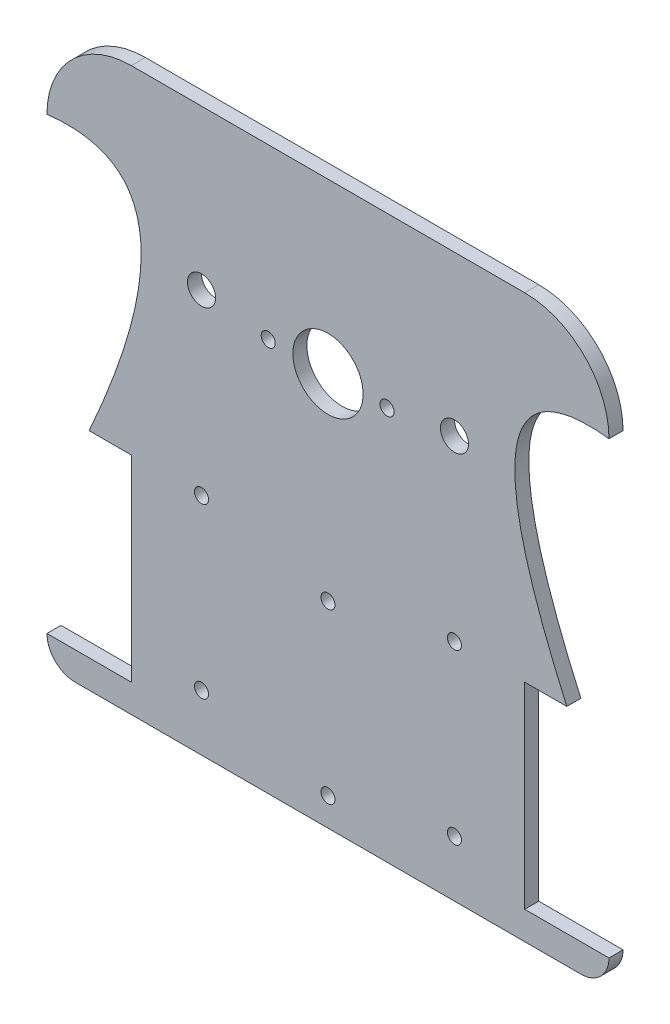
ISO-10303-21;
HEADER;
FILE_DESCRIPTION(('STEP AP214'),'2;1');
FILE_NAME('part.step','',(''),(''),'','','');
FILE_SCHEMA(('AUTOMOTIVE_DESIGN { 1 0 10303 214 1 1 1 1 }'));
ENDSEC;
DATA;
#1=APPLICATION_CONTEXT('core data for automotive mechanical design processes');
#2=APPLICATION_PROTOCOL_DEFINITION('international standard','automotive_design',2000,#1);
#3=PRODUCT_CONTEXT('',#1,'mechanical');
#4=PRODUCT('Part','Part','',(#3));
#5=PRODUCT_RELATED_PRODUCT_CATEGORY('part','',(#4));
#6=PRODUCT_DEFINITION_FORMATION('','',#4);
#7=PRODUCT_DEFINITION_CONTEXT('part definition',#1,'design');
#8=PRODUCT_DEFINITION('design','',#6,#7);
#9=PRODUCT_DEFINITION_SHAPE('','',#8);
#10=(LENGTH_UNIT() NAMED_UNIT(*) SI_UNIT(.MILLI.,.METRE.));
#11=(NAMED_UNIT(*) PLANE_ANGLE_UNIT() SI_UNIT($,.RADIAN.));
#12=(NAMED_UNIT(*) SI_UNIT($,.STERADIAN.) SOLID_ANGLE_UNIT());
#13=UNCERTAINTY_MEASURE_WITH_UNIT(LENGTH_MEASURE(1.E-05),#10,'distance_accuracy_value','');
#14=(GEOMETRIC_REPRESENTATION_CONTEXT(3) GLOBAL_UNCERTAINTY_ASSIGNED_CONTEXT((#13)) GLOBAL_UNIT_ASSIGNED_CONTEXT((#10,
#11,#12)) REPRESENTATION_CONTEXT('',''));
#15=CARTESIAN_POINT('',(0.,0.,0.));
#16=DIRECTION('',(0.,0.,1.));
#17=DIRECTION('',(1.,0.,0.));
#18=AXIS2_PLACEMENT_3D('',#15,#16,#17);
#19=CARTESIAN_POINT('',(90.,-90.,5.));
#20=DIRECTION('',(0.,0.,-1.));
#21=DIRECTION('',(-1.,0.,0.));
#22=AXIS2_PLACEMENT_3D('',#19,#20,#21);
#23=CYLINDRICAL_SURFACE('',#22,9.99999999999999);
#24=CARTESIAN_POINT('',(90.,-90.,0.));
#25=DIRECTION('',(0.,0.,1.));
#26=DIRECTION('',(1.,0.,0.));
#27=AXIS2_PLACEMENT_3D('',#24,#25,#26);
#28=CIRCLE('',#27,9.99999999999999);
#29=CARTESIAN_POINT('',(89.9999999999999,-100.,0.));
#30=VERTEX_POINT('',#29);
#31=CARTESIAN_POINT('',(100.,-90.,0.));
#32=VERTEX_POINT('',#31);
#33=EDGE_CURVE('E172',#30,#32,#28,.T.);
#34=ORIENTED_EDGE('',*,*,#33,.T.);
#35=DIRECTION('',(0.,0.,-1.));
#36=VECTOR('',#35,1.);
#37=CARTESIAN_POINT('',(100.,-89.9999999999999,5.));
#38=LINE('',#37,#36);
#39=CARTESIAN_POINT('',(100.,-90.,5.));
#40=VERTEX_POINT('',#39);
#41=EDGE_CURVE('E11',#40,#32,#38,.T.);
#42=ORIENTED_EDGE('',*,*,#41,.F.);
#43=CARTESIAN_POINT('',(90.,-90.,5.));
#44=DIRECTION('',(0.,0.,1.));
#45=DIRECTION('',(1.,0.,0.));
#46=AXIS2_PLACEMENT_3D('',#43,#44,#45);
#47=CIRCLE('',#46,9.99999999999999);
#48=CARTESIAN_POINT('',(89.9999999999999,-100.,5.));
#49=VERTEX_POINT('',#48);
#50=EDGE_CURVE('E194',#49,#40,#47,.T.);
#51=ORIENTED_EDGE('',*,*,#50,.F.);
#52=DIRECTION('',(0.,0.,-1.));
#53=VECTOR('',#52,1.);
#54=CARTESIAN_POINT('',(89.9999999999999,-100.,5.));
#55=LINE('',#54,#53);
#56=EDGE_CURVE('E209',#49,#30,#55,.T.);
#57=ORIENTED_EDGE('',*,*,#56,.T.);
#58=EDGE_LOOP('',(#34,#42,#51,#57));
#59=FACE_BOUND('',#58,.T.);
#60=ADVANCED_FACE('F33',(#59),#23,.T.);
#61=CARTESIAN_POINT('',(70.,70.,5.));
#62=DIRECTION('',(0.,0.,-1.));
#63=DIRECTION('',(-1.,0.,0.));
#64=AXIS2_PLACEMENT_3D('',#61,#62,#63);
#65=CYLINDRICAL_SURFACE('',#64,30.);
#66=CARTESIAN_POINT('',(70.,70.,0.));
#67=DIRECTION('',(0.,0.,1.));
#68=DIRECTION('',(-1.,0.,0.));
#69=AXIS2_PLACEMENT_3D('',#66,#67,#68);
#70=CIRCLE('',#69,30.);
#71=CARTESIAN_POINT('',(100.,69.9999999999998,0.));
#72=VERTEX_POINT('',#71);
#73=CARTESIAN_POINT('',(69.9999999999998,100.,0.));
#74=VERTEX_POINT('',#73);
#75=EDGE_CURVE('E146',#72,#74,#70,.T.);
#76=ORIENTED_EDGE('',*,*,#75,.T.);
#77=DIRECTION('',(0.,0.,-1.));
#78=VECTOR('',#77,1.);
#79=CARTESIAN_POINT('',(69.9999999999998,100.,5.));
#80=LINE('',#79,#78);
#81=CARTESIAN_POINT('',(69.9999999999998,100.,5.));
#82=VERTEX_POINT('',#81);
#83=EDGE_CURVE('E234',#82,#74,#80,.T.);
#84=ORIENTED_EDGE('',*,*,#83,.F.);
#85=CARTESIAN_POINT('',(70.,70.,5.));
#86=DIRECTION('',(0.,0.,1.));
#87=DIRECTION('',(-1.,0.,0.));
#88=AXIS2_PLACEMENT_3D('',#85,#86,#87);
#89=CIRCLE('',#88,30.);
#90=CARTESIAN_POINT('',(100.,69.9999999999998,5.));
#91=VERTEX_POINT('',#90);
#92=EDGE_CURVE('E197',#91,#82,#89,.T.);
#93=ORIENTED_EDGE('',*,*,#92,.F.);
#94=DIRECTION('',(0.,0.,-1.));
#95=VECTOR('',#94,1.);
#96=CARTESIAN_POINT('',(100.,69.9999999999998,5.));
#97=LINE('',#96,#95);
#98=EDGE_CURVE('E40',#91,#72,#97,.T.);
#99=ORIENTED_EDGE('',*,*,#98,.T.);
#100=EDGE_LOOP('',(#76,#84,#93,#99));
#101=FACE_BOUND('',#100,.T.);
#102=ADVANCED_FACE('F238',(#101),#65,.T.);
#103=CARTESIAN_POINT('',(-69.9999999999998,100.,5.));
#104=DIRECTION('',(0.,-1.,0.));
#105=DIRECTION('',(0.,0.,-1.));
#106=AXIS2_PLACEMENT_3D('',#103,#104,#105);
#107=PLANE('',#106);
#108=DIRECTION('',(-1.,0.,0.));
#109=VECTOR('',#108,1.);
#110=CARTESIAN_POINT('',(-69.9999999999998,100.,0.));
#111=LINE('',#110,#109);
#112=CARTESIAN_POINT('',(-69.9999999999998,100.,0.));
#113=VERTEX_POINT('',#112);
#114=EDGE_CURVE('E213',#74,#113,#111,.T.);
#115=ORIENTED_EDGE('',*,*,#114,.T.);
#116=DIRECTION('',(0.,0.,-1.));
#117=VECTOR('',#116,1.);
#118=CARTESIAN_POINT('',(-69.9999999999998,100.,5.));
#119=LINE('',#118,#117);
#120=CARTESIAN_POINT('',(-69.9999999999998,100.,5.));
#121=VERTEX_POINT('',#120);
#122=EDGE_CURVE('E231',#121,#113,#119,.T.);
#123=ORIENTED_EDGE('',*,*,#122,.F.);
#124=DIRECTION('',(-1.,0.,0.));
#125=VECTOR('',#124,1.);
#126=CARTESIAN_POINT('',(-69.9999999999998,100.,5.));
#127=LINE('',#126,#125);
#128=EDGE_CURVE('E200',#82,#121,#127,.T.);
#129=ORIENTED_EDGE('',*,*,#128,.F.);
#130=ORIENTED_EDGE('',*,*,#83,.T.);
#131=EDGE_LOOP('',(#115,#123,#129,#130));
#132=FACE_BOUND('',#131,.T.);
#133=ADVANCED_FACE('F309',(#132),#107,.F.);
#134=CARTESIAN_POINT('',(-70.,70.,5.));
#135=DIRECTION('',(0.,0.,-1.));
#136=DIRECTION('',(-1.,0.,0.));
#137=AXIS2_PLACEMENT_3D('',#134,#135,#136);
#138=CYLINDRICAL_SURFACE('',#137,30.);
#139=CARTESIAN_POINT('',(-70.,70.,0.));
#140=DIRECTION('',(0.,0.,1.));
#141=DIRECTION('',(-1.,0.,0.));
#142=AXIS2_PLACEMENT_3D('',#139,#140,#141);
#143=CIRCLE('',#142,30.);
#144=CARTESIAN_POINT('',(-100.,69.9999999999998,0.));
#145=VERTEX_POINT('',#144);
#146=EDGE_CURVE('E215',#113,#145,#143,.T.);
#147=ORIENTED_EDGE('',*,*,#146,.T.);
#148=DIRECTION('',(0.,0.,-1.));
#149=VECTOR('',#148,1.);
#150=CARTESIAN_POINT('',(-100.,69.9999999999998,5.));
#151=LINE('',#150,#149);
#152=CARTESIAN_POINT('',(-100.,69.9999999999998,5.));
#153=VERTEX_POINT('',#152);
#154=EDGE_CURVE('E229',#153,#145,#151,.T.);
#155=ORIENTED_EDGE('',*,*,#154,.F.);
#156=CARTESIAN_POINT('',(-70.,70.,5.));
#157=DIRECTION('',(0.,0.,1.));
#158=DIRECTION('',(-1.,0.,0.));
#159=AXIS2_PLACEMENT_3D('',#156,#157,#158);
#160=CIRCLE('',#159,30.);
#161=EDGE_CURVE('E202',#121,#153,#160,.T.);
#162=ORIENTED_EDGE('',*,*,#161,.F.);
#163=ORIENTED_EDGE('',*,*,#122,.T.);
#164=EDGE_LOOP('',(#147,#155,#162,#163));
#165=FACE_BOUND('',#164,.T.);
#166=ADVANCED_FACE('F305',(#165),#138,.T.);
#167=CARTESIAN_POINT('',(-90.,-90.,5.));
#168=DIRECTION('',(0.,0.,-1.));
#169=DIRECTION('',(-1.,0.,0.));
#170=AXIS2_PLACEMENT_3D('',#167,#168,#169);
#171=CYLINDRICAL_SURFACE('',#170,9.99999999999999);
#172=CARTESIAN_POINT('',(-90.,-90.,0.));
#173=DIRECTION('',(0.,0.,1.));
#174=DIRECTION('',(-1.,0.,0.));
#175=AXIS2_PLACEMENT_3D('',#172,#173,#174);
#176=CIRCLE('',#175,9.99999999999999);
#177=CARTESIAN_POINT('',(-99.9999999999999,-90.,0.));
#178=VERTEX_POINT('',#177);
#179=CARTESIAN_POINT('',(-89.9999999999999,-100.,0.));
#180=VERTEX_POINT('',#179);
#181=EDGE_CURVE('E218',#178,#180,#176,.T.);
#182=ORIENTED_EDGE('',*,*,#181,.T.);
#183=DIRECTION('',(0.,0.,-1.));
#184=VECTOR('',#183,1.);
#185=CARTESIAN_POINT('',(-89.9999999999999,-100.,5.));
#186=LINE('',#185,#184);
#187=CARTESIAN_POINT('',(-89.9999999999999,-100.,5.));
#188=VERTEX_POINT('',#187);
#189=EDGE_CURVE('E223',#188,#180,#186,.T.);
#190=ORIENTED_EDGE('',*,*,#189,.F.);
#191=CARTESIAN_POINT('',(-90.,-90.,5.));
#192=DIRECTION('',(0.,0.,1.));
#193=DIRECTION('',(-1.,0.,0.));
#194=AXIS2_PLACEMENT_3D('',#191,#192,#193);
#195=CIRCLE('',#194,9.99999999999999);
#196=CARTESIAN_POINT('',(-99.9999999999999,-90.,5.));
#197=VERTEX_POINT('',#196);
#198=EDGE_CURVE('E205',#197,#188,#195,.T.);
#199=ORIENTED_EDGE('',*,*,#198,.F.);
#200=DIRECTION('',(0.,0.,-1.));
#201=VECTOR('',#200,1.);
#202=CARTESIAN_POINT('',(-100.,-90.,5.));
#203=LINE('',#202,#201);
#204=EDGE_CURVE('E226',#197,#178,#203,.T.);
#205=ORIENTED_EDGE('',*,*,#204,.T.);
#206=EDGE_LOOP('',(#182,#190,#199,#205));
#207=FACE_BOUND('',#206,.T.);
#208=ADVANCED_FACE('F301',(#207),#171,.T.);
#209=CARTESIAN_POINT('',(-89.9999999999999,-100.,5.));
#210=DIRECTION('',(0.,1.,0.));
#211=DIRECTION('',(0.,0.,1.));
#212=AXIS2_PLACEMENT_3D('',#209,#210,#211);
#213=PLANE('',#212);
#214=DIRECTION('',(1.,0.,0.));
#215=VECTOR('',#214,1.);
#216=CARTESIAN_POINT('',(-89.9999999999999,-100.,0.));
#217=LINE('',#216,#215);
#218=EDGE_CURVE('E198',#180,#30,#217,.T.);
#219=ORIENTED_EDGE('',*,*,#218,.T.);
#220=ORIENTED_EDGE('',*,*,#56,.F.);
#221=DIRECTION('',(1.,0.,0.));
#222=VECTOR('',#221,1.);
#223=CARTESIAN_POINT('',(-89.9999999999999,-100.,5.));
#224=LINE('',#223,#222);
#225=EDGE_CURVE('E207',#188,#49,#224,.T.);
#226=ORIENTED_EDGE('',*,*,#225,.F.);
#227=ORIENTED_EDGE('',*,*,#189,.T.);
#228=EDGE_LOOP('',(#219,#220,#226,#227));
#229=FACE_BOUND('',#228,.T.);
#230=ADVANCED_FACE('F294',(#229),#213,.F.);
#231=CARTESIAN_POINT('',(90.,-90.,5.));
#232=DIRECTION('',(0.,0.,1.));
#233=DIRECTION('',(1.,0.,0.));
#234=AXIS2_PLACEMENT_3D('',#231,#232,#233);
#235=PLANE('',#234);
#236=CARTESIAN_POINT('',(21.,40.,5.));
#237=DIRECTION('',(0.,0.,-1.));
#238=DIRECTION('',(-1.,0.,0.));
#239=AXIS2_PLACEMENT_3D('',#236,#237,#238);
#240=CIRCLE('',#239,2.5);
#241=CARTESIAN_POINT('',(18.5,40.,5.));
#242=VERTEX_POINT('',#241);
#243=EDGE_CURVE('E390',#242,#242,#240,.T.);
#244=ORIENTED_EDGE('',*,*,#243,.T.);
#245=EDGE_LOOP('',(#244));
#246=FACE_BOUND('',#245,.T.);
#247=CARTESIAN_POINT('',(-21.26,40.,5.));
#248=DIRECTION('',(0.,0.,-1.));
#249=DIRECTION('',(-1.,0.,0.));
#250=AXIS2_PLACEMENT_3D('',#247,#248,#249);
#251=CIRCLE('',#250,2.5);
#252=CARTESIAN_POINT('',(-23.76,40.,5.));
#253=VERTEX_POINT('',#252);
#254=EDGE_CURVE('E402',#253,#253,#251,.T.);
#255=ORIENTED_EDGE('',*,*,#254,.T.);
#256=EDGE_LOOP('',(#255));
#257=FACE_BOUND('',#256,.T.);
#258=CARTESIAN_POINT('',(0.,40.,5.));
#259=DIRECTION('',(0.,0.,-1.));
#260=DIRECTION('',(-1.,0.,0.));
#261=AXIS2_PLACEMENT_3D('',#258,#259,#260);
#262=CIRCLE('',#261,12.5);
#263=CARTESIAN_POINT('',(-12.5,40.,5.));
#264=VERTEX_POINT('',#263);
#265=EDGE_CURVE('E396',#264,#264,#262,.T.);
#266=ORIENTED_EDGE('',*,*,#265,.T.);
#267=EDGE_LOOP('',(#266));
#268=FACE_BOUND('',#267,.T.);
#269=CARTESIAN_POINT('',(0.,-90.,5.));
#270=DIRECTION('',(0.,0.,1.));
#271=DIRECTION('',(1.,0.,0.));
#272=AXIS2_PLACEMENT_3D('',#269,#270,#271);
#273=CIRCLE('',#272,2.5);
#274=CARTESIAN_POINT('',(2.5,-90.,5.));
#275=VERTEX_POINT('',#274);
#276=EDGE_CURVE('E387',#275,#275,#273,.T.);
#277=ORIENTED_EDGE('',*,*,#276,.F.);
#278=EDGE_LOOP('',(#277));
#279=FACE_BOUND('',#278,.T.);
#280=CARTESIAN_POINT('',(-45.,43.3509985670117,5.));
#281=DIRECTION('',(0.,0.,1.));
#282=DIRECTION('',(1.,0.,0.));
#283=AXIS2_PLACEMENT_3D('',#280,#281,#282);
#284=CIRCLE('',#283,5.);
#285=CARTESIAN_POINT('',(-40.,43.3509985670117,5.));
#286=VERTEX_POINT('',#285);
#287=EDGE_CURVE('E363',#286,#286,#284,.T.);
#288=ORIENTED_EDGE('',*,*,#287,.F.);
#289=EDGE_LOOP('',(#288));
#290=FACE_BOUND('',#289,.T.);
#291=CARTESIAN_POINT('',(-45.,-20.,5.));
#292=DIRECTION('',(0.,0.,1.));
#293=DIRECTION('',(-1.,0.,0.));
#294=AXIS2_PLACEMENT_3D('',#291,#292,#293);
#295=CIRCLE('',#294,2.5);
#296=CARTESIAN_POINT('',(-47.5,-20.,5.));
#297=VERTEX_POINT('',#296);
#298=EDGE_CURVE('E370',#297,#297,#295,.T.);
#299=ORIENTED_EDGE('',*,*,#298,.F.);
#300=EDGE_LOOP('',(#299));
#301=FACE_BOUND('',#300,.T.);
#302=CARTESIAN_POINT('',(45.,-20.,5.));
#303=DIRECTION('',(0.,0.,1.));
#304=DIRECTION('',(-1.,0.,0.));
#305=AXIS2_PLACEMENT_3D('',#302,#303,#304);
#306=CIRCLE('',#305,2.5);
#307=CARTESIAN_POINT('',(42.5,-20.,5.));
#308=VERTEX_POINT('',#307);
#309=EDGE_CURVE('E351',#308,#308,#306,.T.);
#310=ORIENTED_EDGE('',*,*,#309,.F.);
#311=EDGE_LOOP('',(#310));
#312=FACE_BOUND('',#311,.T.);
#313=CARTESIAN_POINT('',(-45.,-80.,5.));
#314=DIRECTION('',(0.,0.,1.));
#315=DIRECTION('',(1.,0.,0.));
#316=AXIS2_PLACEMENT_3D('',#313,#314,#315);
#317=CIRCLE('',#316,2.5);
#318=CARTESIAN_POINT('',(-42.5,-80.,5.));
#319=VERTEX_POINT('',#318);
#320=EDGE_CURVE('E358',#319,#319,#317,.T.);
#321=ORIENTED_EDGE('',*,*,#320,.F.);
#322=EDGE_LOOP('',(#321));
#323=FACE_BOUND('',#322,.T.);
#324=CARTESIAN_POINT('',(45.,43.3509985670117,5.));
#325=DIRECTION('',(0.,0.,1.));
#326=DIRECTION('',(-1.,0.,0.));
#327=AXIS2_PLACEMENT_3D('',#324,#325,#326);
#328=CIRCLE('',#327,5.);
#329=CARTESIAN_POINT('',(40.,43.3509985670117,5.));
#330=VERTEX_POINT('',#329);
#331=EDGE_CURVE('E382',#330,#330,#328,.T.);
#332=ORIENTED_EDGE('',*,*,#331,.F.);
#333=EDGE_LOOP('',(#332));
#334=FACE_BOUND('',#333,.T.);
#335=CARTESIAN_POINT('',(0.,-30.,5.));
#336=DIRECTION('',(0.,0.,1.));
#337=DIRECTION('',(1.,0.,0.));
#338=AXIS2_PLACEMENT_3D('',#335,#336,#337);
#339=CIRCLE('',#338,2.5);
#340=CARTESIAN_POINT('',(2.5,-30.,5.));
#341=VERTEX_POINT('',#340);
#342=EDGE_CURVE('E375',#341,#341,#339,.T.);
#343=ORIENTED_EDGE('',*,*,#342,.F.);
#344=EDGE_LOOP('',(#343));
#345=FACE_BOUND('',#344,.T.);
#346=CARTESIAN_POINT('',(45.,-80.,5.));
#347=DIRECTION('',(0.,0.,1.));
#348=DIRECTION('',(1.,0.,0.));
#349=AXIS2_PLACEMENT_3D('',#346,#347,#348);
#350=CIRCLE('',#349,2.5);
#351=CARTESIAN_POINT('',(47.5,-80.,5.));
#352=VERTEX_POINT('',#351);
#353=EDGE_CURVE('E344',#352,#352,#350,.T.);
#354=ORIENTED_EDGE('',*,*,#353,.F.);
#355=EDGE_LOOP('',(#354));
#356=FACE_BOUND('',#355,.T.);
#357=CARTESIAN_POINT('',(100.,69.9999999999998,5.));
#358=CARTESIAN_POINT('',(41.5627507887384,76.7696481561118,5.));
#359=CARTESIAN_POINT('',(85.,-20.,5.));
#360=B_SPLINE_CURVE_WITH_KNOTS('',2,(#357,#358,#359),.UNSPECIFIED.,.F.,.F.,(3,3),(0.,1.),.UNSPECIFIED.);
#361=CARTESIAN_POINT('',(85.,-20.,5.));
#362=VERTEX_POINT('',#361);
#363=EDGE_CURVE('E55',#91,#362,#360,.T.);
#364=ORIENTED_EDGE('',*,*,#363,.F.);
#365=ORIENTED_EDGE('',*,*,#92,.T.);
#366=ORIENTED_EDGE('',*,*,#128,.T.);
#367=ORIENTED_EDGE('',*,*,#161,.T.);
#368=CARTESIAN_POINT('',(-85.,-20.,5.));
#369=CARTESIAN_POINT('',(-41.5627507887384,76.7696481561117,5.));
#370=CARTESIAN_POINT('',(-100.,69.9999999999998,5.));
#371=B_SPLINE_CURVE_WITH_KNOTS('',2,(#368,#369,#370),.UNSPECIFIED.,.F.,.F.,(3,3),(0.,1.),.UNSPECIFIED.);
#372=CARTESIAN_POINT('',(-85.,-20.,5.));
#373=VERTEX_POINT('',#372);
#374=EDGE_CURVE('E257',#373,#153,#371,.T.);
#375=ORIENTED_EDGE('',*,*,#374,.F.);
#376=DIRECTION('',(-1.,0.,0.));
#377=VECTOR('',#376,1.);
#378=CARTESIAN_POINT('',(-100.,-20.,5.));
#379=LINE('',#378,#377);
#380=CARTESIAN_POINT('',(-70.,-20.,5.));
#381=VERTEX_POINT('',#380);
#382=EDGE_CURVE('E187',#381,#373,#379,.T.);
#383=ORIENTED_EDGE('',*,*,#382,.F.);
#384=DIRECTION('',(0.,1.,0.));
#385=VECTOR('',#384,1.);
#386=CARTESIAN_POINT('',(-70.,-20.,5.));
#387=LINE('',#386,#385);
#388=CARTESIAN_POINT('',(-70.,-90.,5.));
#389=VERTEX_POINT('',#388);
#390=EDGE_CURVE('E137',#389,#381,#387,.T.);
#391=ORIENTED_EDGE('',*,*,#390,.F.);
#392=DIRECTION('',(1.,0.,0.));
#393=VECTOR('',#392,1.);
#394=CARTESIAN_POINT('',(-70.,-90.,5.));
#395=LINE('',#394,#393);
#396=EDGE_CURVE('E178',#197,#389,#395,.T.);
#397=ORIENTED_EDGE('',*,*,#396,.F.);
#398=ORIENTED_EDGE('',*,*,#198,.T.);
#399=ORIENTED_EDGE('',*,*,#225,.T.);
#400=ORIENTED_EDGE('',*,*,#50,.T.);
#401=DIRECTION('',(1.,0.,0.));
#402=VECTOR('',#401,1.);
#403=CARTESIAN_POINT('',(70.,-90.,5.));
#404=LINE('',#403,#402);
#405=CARTESIAN_POINT('',(70.,-90.,5.));
#406=VERTEX_POINT('',#405);
#407=EDGE_CURVE('E153',#406,#40,#404,.T.);
#408=ORIENTED_EDGE('',*,*,#407,.F.);
#409=DIRECTION('',(0.,-1.,0.));
#410=VECTOR('',#409,1.);
#411=CARTESIAN_POINT('',(70.,-20.,5.));
#412=LINE('',#411,#410);
#413=CARTESIAN_POINT('',(70.,-20.,5.));
#414=VERTEX_POINT('',#413);
#415=EDGE_CURVE('E157',#414,#406,#412,.T.);
#416=ORIENTED_EDGE('',*,*,#415,.F.);
#417=DIRECTION('',(-1.,0.,0.));
#418=VECTOR('',#417,1.);
#419=CARTESIAN_POINT('',(100.,-20.,5.));
#420=LINE('',#419,#418);
#421=EDGE_CURVE('E165',#362,#414,#420,.T.);
#422=ORIENTED_EDGE('',*,*,#421,.F.);
#423=EDGE_LOOP('',(#364,#365,#366,#367,#375,#383,#391,#397,#398,#399,#400,#408,#416,#422));
#424=FACE_BOUND('',#423,.T.);
#425=ADVANCED_FACE('F241',(#246,#257,#268,#279,#290,#301,#312,#323,#334,#345,#356,#424),#235,.T.);
#426=CARTESIAN_POINT('',(90.,-90.,0.));
#427=DIRECTION('',(0.,0.,1.));
#428=DIRECTION('',(1.,0.,0.));
#429=AXIS2_PLACEMENT_3D('',#426,#427,#428);
#430=PLANE('',#429);
#431=CARTESIAN_POINT('',(21.,40.,0.));
#432=DIRECTION('',(0.,0.,-1.));
#433=DIRECTION('',(-1.,0.,0.));
#434=AXIS2_PLACEMENT_3D('',#431,#432,#433);
#435=CIRCLE('',#434,2.5);
#436=CARTESIAN_POINT('',(18.5,40.,0.));
#437=VERTEX_POINT('',#436);
#438=EDGE_CURVE('E405',#437,#437,#435,.T.);
#439=ORIENTED_EDGE('',*,*,#438,.F.);
#440=EDGE_LOOP('',(#439));
#441=FACE_BOUND('',#440,.T.);
#442=CARTESIAN_POINT('',(-21.26,40.,0.));
#443=DIRECTION('',(0.,0.,-1.));
#444=DIRECTION('',(-1.,0.,0.));
#445=AXIS2_PLACEMENT_3D('',#442,#443,#444);
#446=CIRCLE('',#445,2.5);
#447=CARTESIAN_POINT('',(-23.76,40.,0.));
#448=VERTEX_POINT('',#447);
#449=EDGE_CURVE('E399',#448,#448,#446,.T.);
#450=ORIENTED_EDGE('',*,*,#449,.F.);
#451=EDGE_LOOP('',(#450));
#452=FACE_BOUND('',#451,.T.);
#453=CARTESIAN_POINT('',(0.,40.,0.));
#454=DIRECTION('',(0.,0.,-1.));
#455=DIRECTION('',(-1.,0.,0.));
#456=AXIS2_PLACEMENT_3D('',#453,#454,#455);
#457=CIRCLE('',#456,12.5);
#458=CARTESIAN_POINT('',(-12.5,40.,0.));
#459=VERTEX_POINT('',#458);
#460=EDGE_CURVE('E393',#459,#459,#457,.T.);
#461=ORIENTED_EDGE('',*,*,#460,.F.);
#462=EDGE_LOOP('',(#461));
#463=FACE_BOUND('',#462,.T.);
#464=CARTESIAN_POINT('',(0.,-90.,0.));
#465=DIRECTION('',(0.,0.,1.));
#466=DIRECTION('',(1.,0.,0.));
#467=AXIS2_PLACEMENT_3D('',#464,#465,#466);
#468=CIRCLE('',#467,2.5);
#469=CARTESIAN_POINT('',(2.5,-90.,0.));
#470=VERTEX_POINT('',#469);
#471=EDGE_CURVE('E379',#470,#470,#468,.T.);
#472=ORIENTED_EDGE('',*,*,#471,.T.);
#473=EDGE_LOOP('',(#472));
#474=FACE_BOUND('',#473,.T.);
#475=CARTESIAN_POINT('',(-45.,43.3509985670117,0.));
#476=DIRECTION('',(0.,0.,1.));
#477=DIRECTION('',(1.,0.,0.));
#478=AXIS2_PLACEMENT_3D('',#475,#476,#477);
#479=CIRCLE('',#478,5.);
#480=CARTESIAN_POINT('',(-40.,43.3509985670117,0.));
#481=VERTEX_POINT('',#480);
#482=EDGE_CURVE('E366',#481,#481,#479,.T.);
#483=ORIENTED_EDGE('',*,*,#482,.T.);
#484=EDGE_LOOP('',(#483));
#485=FACE_BOUND('',#484,.T.);
#486=CARTESIAN_POINT('',(-45.,-20.,0.));
#487=DIRECTION('',(0.,0.,1.));
#488=DIRECTION('',(-1.,0.,0.));
#489=AXIS2_PLACEMENT_3D('',#486,#487,#488);
#490=CIRCLE('',#489,2.5);
#491=CARTESIAN_POINT('',(-47.5,-20.,0.));
#492=VERTEX_POINT('',#491);
#493=EDGE_CURVE('E355',#492,#492,#490,.T.);
#494=ORIENTED_EDGE('',*,*,#493,.T.);
#495=EDGE_LOOP('',(#494));
#496=FACE_BOUND('',#495,.T.);
#497=CARTESIAN_POINT('',(45.,-20.,0.));
#498=DIRECTION('',(0.,0.,1.));
#499=DIRECTION('',(-1.,0.,0.));
#500=AXIS2_PLACEMENT_3D('',#497,#498,#499);
#501=CIRCLE('',#500,2.5);
#502=CARTESIAN_POINT('',(42.5,-20.,0.));
#503=VERTEX_POINT('',#502);
#504=EDGE_CURVE('E354',#503,#503,#501,.T.);
#505=ORIENTED_EDGE('',*,*,#504,.T.);
#506=EDGE_LOOP('',(#505));
#507=FACE_BOUND('',#506,.T.);
#508=CARTESIAN_POINT('',(-45.,-80.,0.));
#509=DIRECTION('',(0.,0.,1.));
#510=DIRECTION('',(1.,0.,0.));
#511=AXIS2_PLACEMENT_3D('',#508,#509,#510);
#512=CIRCLE('',#511,2.5);
#513=CARTESIAN_POINT('',(-42.5,-80.,0.));
#514=VERTEX_POINT('',#513);
#515=EDGE_CURVE('E349',#514,#514,#512,.T.);
#516=ORIENTED_EDGE('',*,*,#515,.T.);
#517=EDGE_LOOP('',(#516));
#518=FACE_BOUND('',#517,.T.);
#519=CARTESIAN_POINT('',(45.,43.3509985670117,0.));
#520=DIRECTION('',(0.,0.,1.));
#521=DIRECTION('',(-1.,0.,0.));
#522=AXIS2_PLACEMENT_3D('',#519,#520,#521);
#523=CIRCLE('',#522,5.);
#524=CARTESIAN_POINT('',(40.,43.3509985670117,0.));
#525=VERTEX_POINT('',#524);
#526=EDGE_CURVE('E367',#525,#525,#523,.T.);
#527=ORIENTED_EDGE('',*,*,#526,.T.);
#528=EDGE_LOOP('',(#527));
#529=FACE_BOUND('',#528,.T.);
#530=CARTESIAN_POINT('',(0.,-30.,0.));
#531=DIRECTION('',(0.,0.,1.));
#532=DIRECTION('',(1.,0.,0.));
#533=AXIS2_PLACEMENT_3D('',#530,#531,#532);
#534=CIRCLE('',#533,2.5);
#535=CARTESIAN_POINT('',(2.5,-30.,0.));
#536=VERTEX_POINT('',#535);
#537=EDGE_CURVE('E378',#536,#536,#534,.T.);
#538=ORIENTED_EDGE('',*,*,#537,.T.);
#539=EDGE_LOOP('',(#538));
#540=FACE_BOUND('',#539,.T.);
#541=CARTESIAN_POINT('',(45.,-80.,0.));
#542=DIRECTION('',(0.,0.,1.));
#543=DIRECTION('',(1.,0.,0.));
#544=AXIS2_PLACEMENT_3D('',#541,#542,#543);
#545=CIRCLE('',#544,2.5);
#546=CARTESIAN_POINT('',(47.5,-80.,0.));
#547=VERTEX_POINT('',#546);
#548=EDGE_CURVE('E342',#547,#547,#545,.T.);
#549=ORIENTED_EDGE('',*,*,#548,.T.);
#550=EDGE_LOOP('',(#549));
#551=FACE_BOUND('',#550,.T.);
#552=ORIENTED_EDGE('',*,*,#75,.F.);
#553=CARTESIAN_POINT('',(100.,69.9999999999998,0.));
#554=CARTESIAN_POINT('',(41.5627507887384,76.7696481561118,0.));
#555=CARTESIAN_POINT('',(85.,-20.,0.));
#556=B_SPLINE_CURVE_WITH_KNOTS('',2,(#553,#554,#555),.UNSPECIFIED.,.F.,.F.,(3,3),(0.,1.),.UNSPECIFIED.);
#557=CARTESIAN_POINT('',(85.,-20.,0.));
#558=VERTEX_POINT('',#557);
#559=EDGE_CURVE('E132',#72,#558,#556,.T.);
#560=ORIENTED_EDGE('',*,*,#559,.T.);
#561=DIRECTION('',(-1.,0.,0.));
#562=VECTOR('',#561,1.);
#563=CARTESIAN_POINT('',(100.,-20.,0.));
#564=LINE('',#563,#562);
#565=CARTESIAN_POINT('',(70.,-20.,0.));
#566=VERTEX_POINT('',#565);
#567=EDGE_CURVE('E143',#558,#566,#564,.T.);
#568=ORIENTED_EDGE('',*,*,#567,.T.);
#569=DIRECTION('',(0.,-1.,0.));
#570=VECTOR('',#569,1.);
#571=CARTESIAN_POINT('',(70.,-20.,0.));
#572=LINE('',#571,#570);
#573=CARTESIAN_POINT('',(70.,-90.,0.));
#574=VERTEX_POINT('',#573);
#575=EDGE_CURVE('E152',#566,#574,#572,.T.);
#576=ORIENTED_EDGE('',*,*,#575,.T.);
#577=DIRECTION('',(1.,0.,0.));
#578=VECTOR('',#577,1.);
#579=CARTESIAN_POINT('',(70.,-90.,0.));
#580=LINE('',#579,#578);
#581=EDGE_CURVE('E155',#574,#32,#580,.T.);
#582=ORIENTED_EDGE('',*,*,#581,.T.);
#583=ORIENTED_EDGE('',*,*,#33,.F.);
#584=ORIENTED_EDGE('',*,*,#218,.F.);
#585=ORIENTED_EDGE('',*,*,#181,.F.);
#586=DIRECTION('',(1.,0.,0.));
#587=VECTOR('',#586,1.);
#588=CARTESIAN_POINT('',(-70.,-90.,0.));
#589=LINE('',#588,#587);
#590=CARTESIAN_POINT('',(-70.,-90.,0.));
#591=VERTEX_POINT('',#590);
#592=EDGE_CURVE('E181',#178,#591,#589,.T.);
#593=ORIENTED_EDGE('',*,*,#592,.T.);
#594=DIRECTION('',(0.,1.,0.));
#595=VECTOR('',#594,1.);
#596=CARTESIAN_POINT('',(-70.,-20.,0.));
#597=LINE('',#596,#595);
#598=CARTESIAN_POINT('',(-70.,-20.,0.));
#599=VERTEX_POINT('',#598);
#600=EDGE_CURVE('E174',#591,#599,#597,.T.);
#601=ORIENTED_EDGE('',*,*,#600,.T.);
#602=DIRECTION('',(-1.,0.,0.));
#603=VECTOR('',#602,1.);
#604=CARTESIAN_POINT('',(-100.,-20.,0.));
#605=LINE('',#604,#603);
#606=CARTESIAN_POINT('',(-85.,-20.,0.));
#607=VERTEX_POINT('',#606);
#608=EDGE_CURVE('E177',#599,#607,#605,.T.);
#609=ORIENTED_EDGE('',*,*,#608,.T.);
#610=CARTESIAN_POINT('',(-85.,-20.,0.));
#611=CARTESIAN_POINT('',(-41.5627507887384,76.7696481561117,0.));
#612=CARTESIAN_POINT('',(-100.,69.9999999999998,0.));
#613=B_SPLINE_CURVE_WITH_KNOTS('',2,(#610,#611,#612),.UNSPECIFIED.,.F.,.F.,(3,3),(0.,1.),.UNSPECIFIED.);
#614=EDGE_CURVE('E47',#607,#145,#613,.T.);
#615=ORIENTED_EDGE('',*,*,#614,.T.);
#616=ORIENTED_EDGE('',*,*,#146,.F.);
#617=ORIENTED_EDGE('',*,*,#114,.F.);
#618=EDGE_LOOP('',(#552,#560,#568,#576,#582,#583,#584,#585,#593,#601,#609,#615,#616,#617));
#619=FACE_BOUND('',#618,.T.);
#620=ADVANCED_FACE('F141',(#441,#452,#463,#474,#485,#496,#507,#518,#529,#540,#551,#619),#430,.F.);
#621=CARTESIAN_POINT('',(-70.,-20.,0.));
#622=DIRECTION('',(1.,0.,0.));
#623=DIRECTION('',(0.,1.,0.));
#624=AXIS2_PLACEMENT_3D('',#621,#622,#623);
#625=PLANE('',#624);
#626=ORIENTED_EDGE('',*,*,#390,.T.);
#627=DIRECTION('',(0.,0.,1.));
#628=VECTOR('',#627,1.);
#629=CARTESIAN_POINT('',(-70.,-20.,0.));
#630=LINE('',#629,#628);
#631=EDGE_CURVE('E184',#599,#381,#630,.T.);
#632=ORIENTED_EDGE('',*,*,#631,.F.);
#633=ORIENTED_EDGE('',*,*,#600,.F.);
#634=DIRECTION('',(0.,0.,1.));
#635=VECTOR('',#634,1.);
#636=CARTESIAN_POINT('',(-70.,-90.,0.));
#637=LINE('',#636,#635);
#638=EDGE_CURVE('E167',#591,#389,#637,.T.);
#639=ORIENTED_EDGE('',*,*,#638,.T.);
#640=EDGE_LOOP('',(#626,#632,#633,#639));
#641=FACE_BOUND('',#640,.T.);
#642=ADVANCED_FACE('F284',(#641),#625,.F.);
#643=CARTESIAN_POINT('',(-70.,-90.,0.));
#644=DIRECTION('',(0.,-1.,0.));
#645=DIRECTION('',(1.,0.,0.));
#646=AXIS2_PLACEMENT_3D('',#643,#644,#645);
#647=PLANE('',#646);
#648=ORIENTED_EDGE('',*,*,#396,.T.);
#649=ORIENTED_EDGE('',*,*,#638,.F.);
#650=ORIENTED_EDGE('',*,*,#592,.F.);
#651=ORIENTED_EDGE('',*,*,#204,.F.);
#652=EDGE_LOOP('',(#648,#649,#650,#651));
#653=FACE_BOUND('',#652,.T.);
#654=ADVANCED_FACE('F281',(#653),#647,.F.);
#655=CARTESIAN_POINT('',(-100.,-20.,0.));
#656=DIRECTION('',(0.,1.,0.));
#657=DIRECTION('',(0.,0.,1.));
#658=AXIS2_PLACEMENT_3D('',#655,#656,#657);
#659=PLANE('',#658);
#660=ORIENTED_EDGE('',*,*,#382,.T.);
#661=DIRECTION('',(0.,0.,1.));
#662=VECTOR('',#661,1.);
#663=CARTESIAN_POINT('',(-85.,-20.,0.));
#664=LINE('',#663,#662);
#665=EDGE_CURVE('E160',#607,#373,#664,.T.);
#666=ORIENTED_EDGE('',*,*,#665,.F.);
#667=ORIENTED_EDGE('',*,*,#608,.F.);
#668=ORIENTED_EDGE('',*,*,#631,.T.);
#669=EDGE_LOOP('',(#660,#666,#667,#668));
#670=FACE_BOUND('',#669,.T.);
#671=ADVANCED_FACE('F274',(#670),#659,.F.);
#672=CARTESIAN_POINT('',(70.,-90.,0.));
#673=DIRECTION('',(0.,-1.,0.));
#674=DIRECTION('',(0.,0.,-1.));
#675=AXIS2_PLACEMENT_3D('',#672,#673,#674);
#676=PLANE('',#675);
#677=ORIENTED_EDGE('',*,*,#407,.T.);
#678=ORIENTED_EDGE('',*,*,#41,.T.);
#679=ORIENTED_EDGE('',*,*,#581,.F.);
#680=DIRECTION('',(0.,0.,1.));
#681=VECTOR('',#680,1.);
#682=CARTESIAN_POINT('',(70.,-90.,0.));
#683=LINE('',#682,#681);
#684=EDGE_CURVE('E170',#574,#406,#683,.T.);
#685=ORIENTED_EDGE('',*,*,#684,.T.);
#686=EDGE_LOOP('',(#677,#678,#679,#685));
#687=FACE_BOUND('',#686,.T.);
#688=ADVANCED_FACE('F270',(#687),#676,.F.);
#689=CARTESIAN_POINT('',(70.,-20.,0.));
#690=DIRECTION('',(-1.,0.,0.));
#691=DIRECTION('',(0.,-1.,0.));
#692=AXIS2_PLACEMENT_3D('',#689,#690,#691);
#693=PLANE('',#692);
#694=ORIENTED_EDGE('',*,*,#415,.T.);
#695=ORIENTED_EDGE('',*,*,#684,.F.);
#696=ORIENTED_EDGE('',*,*,#575,.F.);
#697=DIRECTION('',(0.,0.,1.));
#698=VECTOR('',#697,1.);
#699=CARTESIAN_POINT('',(70.,-20.,0.));
#700=LINE('',#699,#698);
#701=EDGE_CURVE('E151',#566,#414,#700,.T.);
#702=ORIENTED_EDGE('',*,*,#701,.T.);
#703=EDGE_LOOP('',(#694,#695,#696,#702));
#704=FACE_BOUND('',#703,.T.);
#705=ADVANCED_FACE('F273',(#704),#693,.F.);
#706=CARTESIAN_POINT('',(100.,-20.,0.));
#707=DIRECTION('',(0.,1.,0.));
#708=DIRECTION('',(-1.,0.,0.));
#709=AXIS2_PLACEMENT_3D('',#706,#707,#708);
#710=PLANE('',#709);
#711=ORIENTED_EDGE('',*,*,#567,.F.);
#712=DIRECTION('',(0.,0.,1.));
#713=VECTOR('',#712,1.);
#714=CARTESIAN_POINT('',(85.,-20.,0.));
#715=LINE('',#714,#713);
#716=EDGE_CURVE('E129',#558,#362,#715,.T.);
#717=ORIENTED_EDGE('',*,*,#716,.T.);
#718=ORIENTED_EDGE('',*,*,#421,.T.);
#719=ORIENTED_EDGE('',*,*,#701,.F.);
#720=EDGE_LOOP('',(#711,#717,#718,#719));
#721=FACE_BOUND('',#720,.T.);
#722=ADVANCED_FACE('F149',(#721),#710,.F.);
#723=DIRECTION('',(0.,0.,1.));
#724=VECTOR('',#723,1.);
#725=SURFACE_OF_LINEAR_EXTRUSION('',#556,#724);
#726=ORIENTED_EDGE('',*,*,#363,.T.);
#727=ORIENTED_EDGE('',*,*,#716,.F.);
#728=ORIENTED_EDGE('',*,*,#559,.F.);
#729=ORIENTED_EDGE('',*,*,#98,.F.);
#730=EDGE_LOOP('',(#726,#727,#728,#729));
#731=FACE_BOUND('',#730,.T.);
#732=ADVANCED_FACE('F131',(#731),#725,.F.);
#733=DIRECTION('',(0.,0.,1.));
#734=VECTOR('',#733,1.);
#735=SURFACE_OF_LINEAR_EXTRUSION('',#613,#734);
#736=ORIENTED_EDGE('',*,*,#374,.T.);
#737=ORIENTED_EDGE('',*,*,#154,.T.);
#738=ORIENTED_EDGE('',*,*,#614,.F.);
#739=ORIENTED_EDGE('',*,*,#665,.T.);
#740=EDGE_LOOP('',(#736,#737,#738,#739));
#741=FACE_BOUND('',#740,.T.);
#742=ADVANCED_FACE('F264',(#741),#735,.F.);
#743=CARTESIAN_POINT('',(45.,-80.,0.));
#744=DIRECTION('',(0.,0.,1.));
#745=DIRECTION('',(1.,0.,0.));
#746=AXIS2_PLACEMENT_3D('',#743,#744,#745);
#747=CYLINDRICAL_SURFACE('',#746,2.5);
#748=ORIENTED_EDGE('',*,*,#548,.F.);
#749=EDGE_LOOP('',(#748));
#750=FACE_BOUND('',#749,.T.);
#751=ORIENTED_EDGE('',*,*,#353,.T.);
#752=EDGE_LOOP('',(#751));
#753=FACE_BOUND('',#752,.T.);
#754=ADVANCED_FACE('F268',(#750,#753),#747,.F.);
#755=CARTESIAN_POINT('',(0.,-30.,0.));
#756=DIRECTION('',(0.,0.,1.));
#757=DIRECTION('',(1.,0.,0.));
#758=AXIS2_PLACEMENT_3D('',#755,#756,#757);
#759=CYLINDRICAL_SURFACE('',#758,2.5);
#760=ORIENTED_EDGE('',*,*,#537,.F.);
#761=EDGE_LOOP('',(#760));
#762=FACE_BOUND('',#761,.T.);
#763=ORIENTED_EDGE('',*,*,#342,.T.);
#764=EDGE_LOOP('',(#763));
#765=FACE_BOUND('',#764,.T.);
#766=ADVANCED_FACE('F437',(#762,#765),#759,.F.);
#767=CARTESIAN_POINT('',(45.,43.3509985670117,0.));
#768=DIRECTION('',(0.,0.,1.));
#769=DIRECTION('',(1.,0.,0.));
#770=AXIS2_PLACEMENT_3D('',#767,#768,#769);
#771=CYLINDRICAL_SURFACE('',#770,5.);
#772=ORIENTED_EDGE('',*,*,#526,.F.);
#773=EDGE_LOOP('',(#772));
#774=FACE_BOUND('',#773,.T.);
#775=ORIENTED_EDGE('',*,*,#331,.T.);
#776=EDGE_LOOP('',(#775));
#777=FACE_BOUND('',#776,.T.);
#778=ADVANCED_FACE('F440',(#774,#777),#771,.F.);
#779=CARTESIAN_POINT('',(-45.,-80.,0.));
#780=DIRECTION('',(0.,0.,1.));
#781=DIRECTION('',(1.,0.,0.));
#782=AXIS2_PLACEMENT_3D('',#779,#780,#781);
#783=CYLINDRICAL_SURFACE('',#782,2.5);
#784=ORIENTED_EDGE('',*,*,#515,.F.);
#785=EDGE_LOOP('',(#784));
#786=FACE_BOUND('',#785,.T.);
#787=ORIENTED_EDGE('',*,*,#320,.T.);
#788=EDGE_LOOP('',(#787));
#789=FACE_BOUND('',#788,.T.);
#790=ADVANCED_FACE('F456',(#786,#789),#783,.F.);
#791=CARTESIAN_POINT('',(45.,-20.,0.));
#792=DIRECTION('',(0.,0.,1.));
#793=DIRECTION('',(1.,0.,0.));
#794=AXIS2_PLACEMENT_3D('',#791,#792,#793);
#795=CYLINDRICAL_SURFACE('',#794,2.5);
#796=ORIENTED_EDGE('',*,*,#504,.F.);
#797=EDGE_LOOP('',(#796));
#798=FACE_BOUND('',#797,.T.);
#799=ORIENTED_EDGE('',*,*,#309,.T.);
#800=EDGE_LOOP('',(#799));
#801=FACE_BOUND('',#800,.T.);
#802=ADVANCED_FACE('F452',(#798,#801),#795,.F.);
#803=CARTESIAN_POINT('',(-45.,-20.,0.));
#804=DIRECTION('',(0.,0.,1.));
#805=DIRECTION('',(1.,0.,0.));
#806=AXIS2_PLACEMENT_3D('',#803,#804,#805);
#807=CYLINDRICAL_SURFACE('',#806,2.5);
#808=ORIENTED_EDGE('',*,*,#493,.F.);
#809=EDGE_LOOP('',(#808));
#810=FACE_BOUND('',#809,.T.);
#811=ORIENTED_EDGE('',*,*,#298,.T.);
#812=EDGE_LOOP('',(#811));
#813=FACE_BOUND('',#812,.T.);
#814=ADVANCED_FACE('F455',(#810,#813),#807,.F.);
#815=CARTESIAN_POINT('',(-45.,43.3509985670117,0.));
#816=DIRECTION('',(0.,0.,1.));
#817=DIRECTION('',(1.,0.,0.));
#818=AXIS2_PLACEMENT_3D('',#815,#816,#817);
#819=CYLINDRICAL_SURFACE('',#818,5.);
#820=ORIENTED_EDGE('',*,*,#482,.F.);
#821=EDGE_LOOP('',(#820));
#822=FACE_BOUND('',#821,.T.);
#823=ORIENTED_EDGE('',*,*,#287,.T.);
#824=EDGE_LOOP('',(#823));
#825=FACE_BOUND('',#824,.T.);
#826=ADVANCED_FACE('F461',(#822,#825),#819,.F.);
#827=CARTESIAN_POINT('',(0.,-90.,0.));
#828=DIRECTION('',(0.,0.,1.));
#829=DIRECTION('',(1.,0.,0.));
#830=AXIS2_PLACEMENT_3D('',#827,#828,#829);
#831=CYLINDRICAL_SURFACE('',#830,2.5);
#832=ORIENTED_EDGE('',*,*,#471,.F.);
#833=EDGE_LOOP('',(#832));
#834=FACE_BOUND('',#833,.T.);
#835=ORIENTED_EDGE('',*,*,#276,.T.);
#836=EDGE_LOOP('',(#835));
#837=FACE_BOUND('',#836,.T.);
#838=ADVANCED_FACE('F464',(#834,#837),#831,.F.);
#839=CARTESIAN_POINT('',(0.,40.,5.));
#840=DIRECTION('',(0.,0.,-1.));
#841=DIRECTION('',(-1.,0.,0.));
#842=AXIS2_PLACEMENT_3D('',#839,#840,#841);
#843=CYLINDRICAL_SURFACE('',#842,12.5);
#844=ORIENTED_EDGE('',*,*,#265,.F.);
#845=EDGE_LOOP('',(#844));
#846=FACE_BOUND('',#845,.T.);
#847=ORIENTED_EDGE('',*,*,#460,.T.);
#848=EDGE_LOOP('',(#847));
#849=FACE_BOUND('',#848,.T.);
#850=ADVANCED_FACE('F474',(#846,#849),#843,.F.);
#851=CARTESIAN_POINT('',(-21.26,40.,5.));
#852=DIRECTION('',(0.,0.,-1.));
#853=DIRECTION('',(-1.,0.,0.));
#854=AXIS2_PLACEMENT_3D('',#851,#852,#853);
#855=CYLINDRICAL_SURFACE('',#854,2.5);
#856=ORIENTED_EDGE('',*,*,#254,.F.);
#857=EDGE_LOOP('',(#856));
#858=FACE_BOUND('',#857,.T.);
#859=ORIENTED_EDGE('',*,*,#449,.T.);
#860=EDGE_LOOP('',(#859));
#861=FACE_BOUND('',#860,.T.);
#862=ADVANCED_FACE('F415',(#858,#861),#855,.F.);
#863=CARTESIAN_POINT('',(21.,40.,5.));
#864=DIRECTION('',(0.,0.,-1.));
#865=DIRECTION('',(-1.,0.,0.));
#866=AXIS2_PLACEMENT_3D('',#863,#864,#865);
#867=CYLINDRICAL_SURFACE('',#866,2.5);
#868=ORIENTED_EDGE('',*,*,#243,.F.);
#869=EDGE_LOOP('',(#868));
#870=FACE_BOUND('',#869,.T.);
#871=ORIENTED_EDGE('',*,*,#438,.T.);
#872=EDGE_LOOP('',(#871));
#873=FACE_BOUND('',#872,.T.);
#874=ADVANCED_FACE('F412',(#870,#873),#867,.F.);
#875=CLOSED_SHELL('',(#60,#102,#133,#166,#208,#230,#425,#620,#642,#654,#671,#688,#705,#722,#732,
#742,#754,#766,#778,#790,#802,#814,#826,#838,#850,#862,#874));
#876=MANIFOLD_SOLID_BREP('B2',#875);
#877=ADVANCED_BREP_SHAPE_REPRESENTATION('',(#18,#876),#14);
#878=SHAPE_DEFINITION_REPRESENTATION(#9,#877);
ENDSEC;
END-ISO-10303-21;
